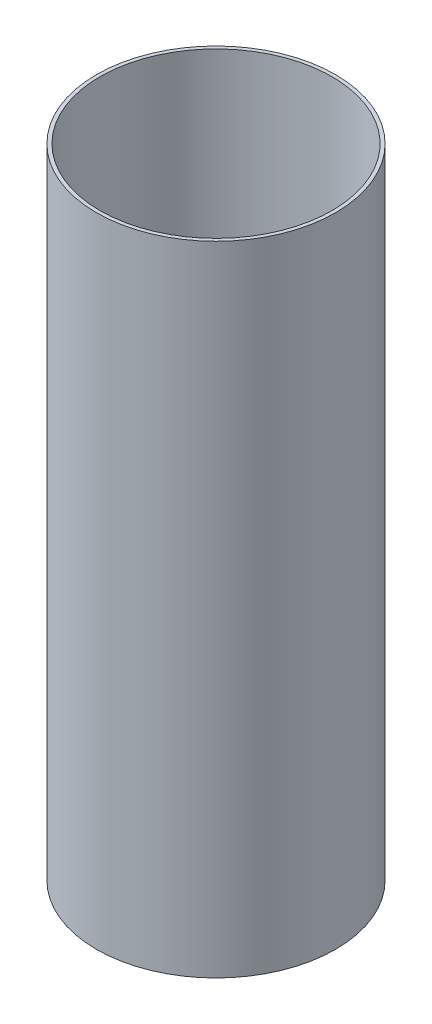
ISO-10303-21;
HEADER;
FILE_DESCRIPTION(('STEP AP214'),'2;1');
FILE_NAME('part.step','',(''),(''),'','','');
FILE_SCHEMA(('AUTOMOTIVE_DESIGN { 1 0 10303 214 1 1 1 1 }'));
ENDSEC;
DATA;
#1=APPLICATION_CONTEXT('core data for automotive mechanical design processes');
#2=APPLICATION_PROTOCOL_DEFINITION('international standard','automotive_design',2000,#1);
#3=PRODUCT_CONTEXT('',#1,'mechanical');
#4=PRODUCT('Part','Part','',(#3));
#5=PRODUCT_RELATED_PRODUCT_CATEGORY('part','',(#4));
#6=PRODUCT_DEFINITION_FORMATION('','',#4);
#7=PRODUCT_DEFINITION_CONTEXT('part definition',#1,'design');
#8=PRODUCT_DEFINITION('design','',#6,#7);
#9=PRODUCT_DEFINITION_SHAPE('','',#8);
#10=(LENGTH_UNIT() NAMED_UNIT(*) SI_UNIT(.MILLI.,.METRE.));
#11=(NAMED_UNIT(*) PLANE_ANGLE_UNIT() SI_UNIT($,.RADIAN.));
#12=(NAMED_UNIT(*) SI_UNIT($,.STERADIAN.) SOLID_ANGLE_UNIT());
#13=UNCERTAINTY_MEASURE_WITH_UNIT(LENGTH_MEASURE(1.E-05),#10,'distance_accuracy_value','');
#14=(GEOMETRIC_REPRESENTATION_CONTEXT(3) GLOBAL_UNCERTAINTY_ASSIGNED_CONTEXT((#13)) GLOBAL_UNIT_ASSIGNED_CONTEXT((#10,
#11,#12)) REPRESENTATION_CONTEXT('',''));
#15=CARTESIAN_POINT('',(0.,0.,0.));
#16=DIRECTION('',(0.,0.,1.));
#17=DIRECTION('',(1.,0.,0.));
#18=AXIS2_PLACEMENT_3D('',#15,#16,#17);
#19=CARTESIAN_POINT('',(0.,406.4,0.));
#20=DIRECTION('',(0.,1.,0.));
#21=DIRECTION('',(0.,0.,1.));
#22=AXIS2_PLACEMENT_3D('',#19,#20,#21);
#23=PLANE('',#22);
#24=CARTESIAN_POINT('',(0.,406.4,0.));
#25=DIRECTION('',(0.,1.,0.));
#26=DIRECTION('',(0.,0.,1.));
#27=AXIS2_PLACEMENT_3D('',#24,#25,#26);
#28=CIRCLE('',#27,76.1746);
#29=CARTESIAN_POINT('',(0.,406.4,76.1746));
#30=VERTEX_POINT('',#29);
#31=EDGE_CURVE('E10',#30,#30,#28,.T.);
#32=ORIENTED_EDGE('',*,*,#31,.T.);
#33=EDGE_LOOP('',(#32));
#34=FACE_BOUND('',#33,.T.);
#35=CARTESIAN_POINT('',(0.,406.4,0.));
#36=DIRECTION('',(0.,1.,0.));
#37=DIRECTION('',(0.,0.,1.));
#38=AXIS2_PLACEMENT_3D('',#35,#36,#37);
#39=CIRCLE('',#38,73.914);
#40=CARTESIAN_POINT('',(0.,406.4,73.914));
#41=VERTEX_POINT('',#40);
#42=EDGE_CURVE('E48',#41,#41,#39,.T.);
#43=ORIENTED_EDGE('',*,*,#42,.F.);
#44=EDGE_LOOP('',(#43));
#45=FACE_BOUND('',#44,.T.);
#46=ADVANCED_FACE('F37',(#34,#45),#23,.T.);
#47=CARTESIAN_POINT('',(0.,0.,0.));
#48=DIRECTION('',(0.,1.,0.));
#49=DIRECTION('',(0.,0.,1.));
#50=AXIS2_PLACEMENT_3D('',#47,#48,#49);
#51=PLANE('',#50);
#52=CARTESIAN_POINT('',(0.,0.,0.));
#53=DIRECTION('',(0.,1.,0.));
#54=DIRECTION('',(0.,0.,1.));
#55=AXIS2_PLACEMENT_3D('',#52,#53,#54);
#56=CIRCLE('',#55,76.1746);
#57=CARTESIAN_POINT('',(0.,0.,76.1746));
#58=VERTEX_POINT('',#57);
#59=EDGE_CURVE('E41',#58,#58,#56,.T.);
#60=ORIENTED_EDGE('',*,*,#59,.F.);
#61=EDGE_LOOP('',(#60));
#62=FACE_BOUND('',#61,.T.);
#63=CARTESIAN_POINT('',(0.,0.,0.));
#64=DIRECTION('',(0.,1.,0.));
#65=DIRECTION('',(0.,0.,1.));
#66=AXIS2_PLACEMENT_3D('',#63,#64,#65);
#67=CIRCLE('',#66,73.914);
#68=CARTESIAN_POINT('',(0.,0.,73.914));
#69=VERTEX_POINT('',#68);
#70=EDGE_CURVE('E50',#69,#69,#67,.T.);
#71=ORIENTED_EDGE('',*,*,#70,.T.);
#72=EDGE_LOOP('',(#71));
#73=FACE_BOUND('',#72,.T.);
#74=ADVANCED_FACE('F60',(#62,#73),#51,.F.);
#75=CARTESIAN_POINT('',(0.,406.4,0.));
#76=DIRECTION('',(0.,-1.,0.));
#77=DIRECTION('',(0.,0.,-1.));
#78=AXIS2_PLACEMENT_3D('',#75,#76,#77);
#79=CYLINDRICAL_SURFACE('',#78,76.1746);
#80=ORIENTED_EDGE('',*,*,#31,.F.);
#81=EDGE_LOOP('',(#80));
#82=FACE_BOUND('',#81,.T.);
#83=ORIENTED_EDGE('',*,*,#59,.T.);
#84=EDGE_LOOP('',(#83));
#85=FACE_BOUND('',#84,.T.);
#86=ADVANCED_FACE('F39',(#82,#85),#79,.T.);
#87=CARTESIAN_POINT('',(0.,406.4,0.));
#88=DIRECTION('',(0.,-1.,0.));
#89=DIRECTION('',(0.,0.,-1.));
#90=AXIS2_PLACEMENT_3D('',#87,#88,#89);
#91=CYLINDRICAL_SURFACE('',#90,73.914);
#92=ORIENTED_EDGE('',*,*,#42,.T.);
#93=EDGE_LOOP('',(#92));
#94=FACE_BOUND('',#93,.T.);
#95=ORIENTED_EDGE('',*,*,#70,.F.);
#96=EDGE_LOOP('',(#95));
#97=FACE_BOUND('',#96,.T.);
#98=ADVANCED_FACE('F56',(#94,#97),#91,.F.);
#99=CLOSED_SHELL('',(#46,#74,#86,#98));
#100=MANIFOLD_SOLID_BREP('B2',#99);
#101=ADVANCED_BREP_SHAPE_REPRESENTATION('',(#18,#100),#14);
#102=SHAPE_DEFINITION_REPRESENTATION(#9,#101);
ENDSEC;
END-ISO-10303-21;
